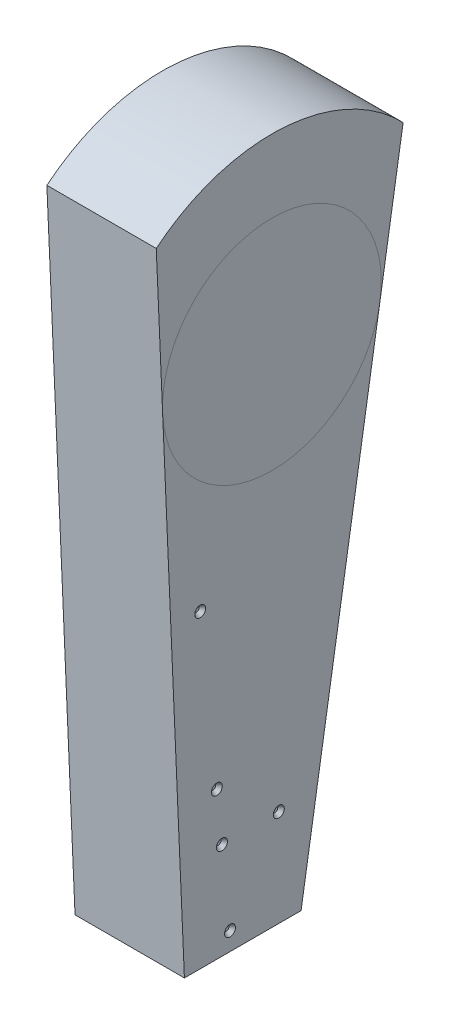
ISO-10303-21;
HEADER;
FILE_DESCRIPTION(('STEP AP214'),'2;1');
FILE_NAME('part.step','',(''),(''),'','','');
FILE_SCHEMA(('AUTOMOTIVE_DESIGN { 1 0 10303 214 1 1 1 1 }'));
ENDSEC;
DATA;
#1=APPLICATION_CONTEXT('core data for automotive mechanical design processes');
#2=APPLICATION_PROTOCOL_DEFINITION('international standard','automotive_design',2000,#1);
#3=PRODUCT_CONTEXT('',#1,'mechanical');
#4=PRODUCT('Part','Part','',(#3));
#5=PRODUCT_RELATED_PRODUCT_CATEGORY('part','',(#4));
#6=PRODUCT_DEFINITION_FORMATION('','',#4);
#7=PRODUCT_DEFINITION_CONTEXT('part definition',#1,'design');
#8=PRODUCT_DEFINITION('design','',#6,#7);
#9=PRODUCT_DEFINITION_SHAPE('','',#8);
#10=(LENGTH_UNIT() NAMED_UNIT(*) SI_UNIT(.MILLI.,.METRE.));
#11=(NAMED_UNIT(*) PLANE_ANGLE_UNIT() SI_UNIT($,.RADIAN.));
#12=(NAMED_UNIT(*) SI_UNIT($,.STERADIAN.) SOLID_ANGLE_UNIT());
#13=UNCERTAINTY_MEASURE_WITH_UNIT(LENGTH_MEASURE(1.E-05),#10,'distance_accuracy_value','');
#14=(GEOMETRIC_REPRESENTATION_CONTEXT(3) GLOBAL_UNCERTAINTY_ASSIGNED_CONTEXT((#13)) GLOBAL_UNIT_ASSIGNED_CONTEXT((#10,
#11,#12)) REPRESENTATION_CONTEXT('',''));
#15=CARTESIAN_POINT('',(0.,0.,0.));
#16=DIRECTION('',(0.,0.,1.));
#17=DIRECTION('',(1.,0.,0.));
#18=AXIS2_PLACEMENT_3D('',#15,#16,#17);
#19=CARTESIAN_POINT('',(76.2,-351.790000010146,60.94000004));
#20=DIRECTION('',(0.,1.,0.));
#21=DIRECTION('',(0.,0.,1.));
#22=AXIS2_PLACEMENT_3D('',#19,#20,#21);
#23=PLANE('',#22);
#24=DIRECTION('',(0.,0.,-1.));
#25=VECTOR('',#24,1.);
#26=CARTESIAN_POINT('',(0.,-351.790000010146,60.94000004));
#27=LINE('',#26,#25);
#28=CARTESIAN_POINT('',(0.,-351.790000010146,60.94000004));
#29=VERTEX_POINT('',#28);
#30=CARTESIAN_POINT('',(0.,-351.790000010146,-20.33999996));
#31=VERTEX_POINT('',#30);
#32=EDGE_CURVE('E108',#29,#31,#27,.T.);
#33=ORIENTED_EDGE('',*,*,#32,.T.);
#34=DIRECTION('',(-1.,0.,0.));
#35=VECTOR('',#34,1.);
#36=CARTESIAN_POINT('',(76.2,-351.790000010146,-20.33999996));
#37=LINE('',#36,#35);
#38=CARTESIAN_POINT('',(76.2,-351.790000010146,-20.33999996));
#39=VERTEX_POINT('',#38);
#40=EDGE_CURVE('E90',#39,#31,#37,.T.);
#41=ORIENTED_EDGE('',*,*,#40,.F.);
#42=DIRECTION('',(0.,0.,-1.));
#43=VECTOR('',#42,1.);
#44=CARTESIAN_POINT('',(76.2,-351.790000010146,60.94000004));
#45=LINE('',#44,#43);
#46=CARTESIAN_POINT('',(76.2,-351.790000010146,60.94000004));
#47=VERTEX_POINT('',#46);
#48=EDGE_CURVE('E97',#47,#39,#45,.T.);
#49=ORIENTED_EDGE('',*,*,#48,.F.);
#50=DIRECTION('',(-1.,0.,0.));
#51=VECTOR('',#50,1.);
#52=CARTESIAN_POINT('',(76.2,-351.790000010146,60.94000004));
#53=LINE('',#52,#51);
#54=EDGE_CURVE('E119',#47,#29,#53,.T.);
#55=ORIENTED_EDGE('',*,*,#54,.T.);
#56=EDGE_LOOP('',(#33,#41,#49,#55));
#57=FACE_BOUND('',#56,.T.);
#58=CARTESIAN_POINT('',(38.1,-351.790000010146,20.30000004));
#59=DIRECTION('',(0.,1.,0.));
#60=DIRECTION('',(0.,0.,1.));
#61=AXIS2_PLACEMENT_3D('',#58,#59,#60);
#62=CIRCLE('',#61,25.4);
#63=CARTESIAN_POINT('',(38.1,-351.790000010146,45.70000004));
#64=VERTEX_POINT('',#63);
#65=EDGE_CURVE('E11',#64,#64,#62,.F.);
#66=ORIENTED_EDGE('',*,*,#65,.F.);
#67=EDGE_LOOP('',(#66));
#68=FACE_BOUND('',#67,.T.);
#69=ADVANCED_FACE('F41',(#57,#68),#23,.F.);
#70=CARTESIAN_POINT('',(76.2,0.,0.));
#71=DIRECTION('',(1.,0.,0.));
#72=DIRECTION('',(0.,0.,-1.));
#73=AXIS2_PLACEMENT_3D('',#70,#71,#72);
#74=PLANE('',#73);
#75=CARTESIAN_POINT('',(76.2,-284.339077712489,-4.8194607374854));
#76=DIRECTION('',(1.,0.,0.));
#77=DIRECTION('',(0.,0.,-1.));
#78=AXIS2_PLACEMENT_3D('',#75,#76,#77);
#79=CIRCLE('',#78,3.81);
#80=CARTESIAN_POINT('',(76.2,-284.339077712489,-8.6294607374854));
#81=VERTEX_POINT('',#80);
#82=EDGE_CURVE('E158',#81,#81,#79,.T.);
#83=ORIENTED_EDGE('',*,*,#82,.F.);
#84=EDGE_LOOP('',(#83));
#85=FACE_BOUND('',#84,.T.);
#86=CARTESIAN_POINT('',(76.2,-339.090000010146,29.1719194246491));
#87=DIRECTION('',(1.,0.,0.));
#88=DIRECTION('',(0.,0.,-1.));
#89=AXIS2_PLACEMENT_3D('',#86,#87,#88);
#90=CIRCLE('',#89,3.81);
#91=CARTESIAN_POINT('',(76.2,-339.090000010146,25.3619194246491));
#92=VERTEX_POINT('',#91);
#93=EDGE_CURVE('E152',#92,#92,#90,.T.);
#94=ORIENTED_EDGE('',*,*,#93,.F.);
#95=EDGE_LOOP('',(#94));
#96=FACE_BOUND('',#95,.T.);
#97=CARTESIAN_POINT('',(76.2,-284.339077712489,34.768096530757));
#98=DIRECTION('',(1.,0.,0.));
#99=DIRECTION('',(0.,0.,-1.));
#100=AXIS2_PLACEMENT_3D('',#97,#98,#99);
#101=CIRCLE('',#100,3.81);
#102=CARTESIAN_POINT('',(76.2,-284.339077712489,30.958096530757));
#103=VERTEX_POINT('',#102);
#104=EDGE_CURVE('E146',#103,#103,#101,.T.);
#105=ORIENTED_EDGE('',*,*,#104,.F.);
#106=EDGE_LOOP('',(#105));
#107=FACE_BOUND('',#106,.T.);
#108=CARTESIAN_POINT('',(76.2,-249.174001321091,38.3623737991144));
#109=DIRECTION('',(1.,0.,0.));
#110=DIRECTION('',(0.,0.,-1.));
#111=AXIS2_PLACEMENT_3D('',#108,#109,#110);
#112=CIRCLE('',#111,3.81);
#113=CARTESIAN_POINT('',(76.2,-249.174001321091,34.5523737991144));
#114=VERTEX_POINT('',#113);
#115=EDGE_CURVE('E140',#114,#114,#112,.T.);
#116=ORIENTED_EDGE('',*,*,#115,.F.);
#117=EDGE_LOOP('',(#116));
#118=FACE_BOUND('',#117,.T.);
#119=CARTESIAN_POINT('',(76.2,-136.12684472737,49.9170998766228));
#120=DIRECTION('',(1.,0.,0.));
#121=DIRECTION('',(0.,0.,-1.));
#122=AXIS2_PLACEMENT_3D('',#119,#120,#121);
#123=CIRCLE('',#122,3.81);
#124=CARTESIAN_POINT('',(76.2,-136.12684472737,46.1070998766228));
#125=VERTEX_POINT('',#124);
#126=EDGE_CURVE('E134',#125,#125,#123,.T.);
#127=ORIENTED_EDGE('',*,*,#126,.F.);
#128=EDGE_LOOP('',(#127));
#129=FACE_BOUND('',#128,.T.);
#130=DIRECTION('',(0.,0.987193343380157,-0.159528376115059));
#131=VECTOR('',#130,1.);
#132=CARTESIAN_POINT('',(76.2,-351.790000010146,-20.33999996));
#133=LINE('',#132,#131);
#134=CARTESIAN_POINT('',(76.2,-12.1560622599675,-75.2241327655679));
#135=VERTEX_POINT('',#134);
#136=EDGE_CURVE('E86',#39,#135,#133,.T.);
#137=ORIENTED_EDGE('',*,*,#136,.T.);
#138=CARTESIAN_POINT('',(76.2,0.,0.));
#139=DIRECTION('',(1.,0.,0.));
#140=DIRECTION('',(0.,0.,-1.));
#141=AXIS2_PLACEMENT_3D('',#138,#139,#140);
#142=CIRCLE('',#141,76.2);
#143=CARTESIAN_POINT('',(76.2,-3.31793432435695,76.1277302421349));
#144=VERTEX_POINT('',#143);
#145=EDGE_CURVE('E50',#135,#144,#142,.F.);
#146=ORIENTED_EDGE('',*,*,#145,.T.);
#147=DIRECTION('',(0.,-0.999051577980772,-0.0435424452015347));
#148=VECTOR('',#147,1.);
#149=CARTESIAN_POINT('',(76.2,-351.790000010146,60.94000004));
#150=LINE('',#149,#148);
#151=EDGE_CURVE('E100',#144,#47,#150,.T.);
#152=ORIENTED_EDGE('',*,*,#151,.T.);
#153=ORIENTED_EDGE('',*,*,#48,.T.);
#154=EDGE_LOOP('',(#137,#146,#152,#153));
#155=FACE_BOUND('',#154,.T.);
#156=ADVANCED_FACE('F98',(#85,#96,#107,#118,#129,#155),#74,.T.);
#157=CARTESIAN_POINT('',(76.2,98.1857059984895,80.5516426746108));
#158=VERTEX_POINT('',#157);
#159=EDGE_CURVE('E121',#158,#144,#150,.T.);
#160=ORIENTED_EDGE('',*,*,#159,.T.);
#161=EDGE_CURVE('E109',#144,#135,#142,.F.);
#162=ORIENTED_EDGE('',*,*,#161,.T.);
#163=CARTESIAN_POINT('',(76.2,88.1427814274564,-91.432215778858));
#164=VERTEX_POINT('',#163);
#165=EDGE_CURVE('E93',#135,#164,#133,.T.);
#166=ORIENTED_EDGE('',*,*,#165,.T.);
#167=CARTESIAN_POINT('',(76.2,0.,0.));
#168=DIRECTION('',(1.,0.,0.));
#169=DIRECTION('',(0.,0.,-1.));
#170=AXIS2_PLACEMENT_3D('',#167,#168,#169);
#171=CIRCLE('',#170,127.);
#172=EDGE_CURVE('E94',#164,#158,#171,.T.);
#173=ORIENTED_EDGE('',*,*,#172,.T.);
#174=EDGE_LOOP('',(#160,#162,#166,#173));
#175=FACE_BOUND('',#174,.T.);
#176=ADVANCED_FACE('F240',(#175),#74,.T.);
#177=ORIENTED_EDGE('',*,*,#65,.T.);
#178=EDGE_LOOP('',(#177));
#179=FACE_BOUND('',#178,.T.);
#180=ADVANCED_FACE('F43',(#179),#23,.F.);
#181=CARTESIAN_POINT('',(76.2,-351.790000010146,-20.33999996));
#182=DIRECTION('',(0.,0.15952837611506,0.987193343380157));
#183=DIRECTION('',(0.,-0.987193343380157,0.15952837611506));
#184=AXIS2_PLACEMENT_3D('',#181,#182,#183);
#185=PLANE('',#184);
#186=DIRECTION('',(0.,0.987193343380157,-0.159528376115059));
#187=VECTOR('',#186,1.);
#188=CARTESIAN_POINT('',(0.,-351.790000010146,-20.33999996));
#189=LINE('',#188,#187);
#190=CARTESIAN_POINT('',(0.,88.1427814274564,-91.432215778858));
#191=VERTEX_POINT('',#190);
#192=EDGE_CURVE('E125',#31,#191,#189,.T.);
#193=ORIENTED_EDGE('',*,*,#192,.T.);
#194=DIRECTION('',(-1.,0.,0.));
#195=VECTOR('',#194,1.);
#196=CARTESIAN_POINT('',(76.2,88.1427814274564,-91.432215778858));
#197=LINE('',#196,#195);
#198=EDGE_CURVE('E110',#164,#191,#197,.T.);
#199=ORIENTED_EDGE('',*,*,#198,.F.);
#200=ORIENTED_EDGE('',*,*,#165,.F.);
#201=ORIENTED_EDGE('',*,*,#136,.F.);
#202=ORIENTED_EDGE('',*,*,#40,.T.);
#203=EDGE_LOOP('',(#193,#199,#200,#201,#202));
#204=FACE_BOUND('',#203,.T.);
#205=ADVANCED_FACE('F88',(#204),#185,.F.);
#206=CARTESIAN_POINT('',(76.2,0.,0.));
#207=DIRECTION('',(-1.,0.,0.));
#208=DIRECTION('',(0.,0.,1.));
#209=AXIS2_PLACEMENT_3D('',#206,#207,#208);
#210=CYLINDRICAL_SURFACE('',#209,127.);
#211=CARTESIAN_POINT('',(0.,0.,0.));
#212=DIRECTION('',(1.,0.,0.));
#213=DIRECTION('',(0.,0.,-1.));
#214=AXIS2_PLACEMENT_3D('',#211,#212,#213);
#215=CIRCLE('',#214,127.);
#216=CARTESIAN_POINT('',(0.,98.1857059984895,80.5516426746108));
#217=VERTEX_POINT('',#216);
#218=EDGE_CURVE('E123',#191,#217,#215,.T.);
#219=ORIENTED_EDGE('',*,*,#218,.T.);
#220=DIRECTION('',(-1.,0.,0.));
#221=VECTOR('',#220,1.);
#222=CARTESIAN_POINT('',(76.2,98.1857059984895,80.5516426746108));
#223=LINE('',#222,#221);
#224=EDGE_CURVE('E114',#158,#217,#223,.T.);
#225=ORIENTED_EDGE('',*,*,#224,.F.);
#226=ORIENTED_EDGE('',*,*,#172,.F.);
#227=ORIENTED_EDGE('',*,*,#198,.T.);
#228=EDGE_LOOP('',(#219,#225,#226,#227));
#229=FACE_BOUND('',#228,.T.);
#230=ADVANCED_FACE('F236',(#229),#210,.T.);
#231=CARTESIAN_POINT('',(76.2,-351.790000010146,60.94000004));
#232=DIRECTION('',(0.,0.0435424452015347,-0.999051577980772));
#233=DIRECTION('',(0.,0.999051577980772,0.0435424452015347));
#234=AXIS2_PLACEMENT_3D('',#231,#232,#233);
#235=PLANE('',#234);
#236=DIRECTION('',(0.,-0.999051577980772,-0.0435424452015347));
#237=VECTOR('',#236,1.);
#238=CARTESIAN_POINT('',(0.,-351.790000010146,60.94000004));
#239=LINE('',#238,#237);
#240=EDGE_CURVE('E104',#217,#29,#239,.T.);
#241=ORIENTED_EDGE('',*,*,#240,.T.);
#242=ORIENTED_EDGE('',*,*,#54,.F.);
#243=ORIENTED_EDGE('',*,*,#151,.F.);
#244=ORIENTED_EDGE('',*,*,#159,.F.);
#245=ORIENTED_EDGE('',*,*,#224,.T.);
#246=EDGE_LOOP('',(#241,#242,#243,#244,#245));
#247=FACE_BOUND('',#246,.T.);
#248=ADVANCED_FACE('F242',(#247),#235,.F.);
#249=ORIENTED_EDGE('',*,*,#145,.F.);
#250=ORIENTED_EDGE('',*,*,#161,.F.);
#251=EDGE_LOOP('',(#249,#250));
#252=FACE_BOUND('',#251,.T.);
#253=ADVANCED_FACE('F216',(#252),#74,.T.);
#254=CARTESIAN_POINT('',(0.,0.,0.));
#255=DIRECTION('',(1.,0.,0.));
#256=DIRECTION('',(0.,0.,-1.));
#257=AXIS2_PLACEMENT_3D('',#254,#255,#256);
#258=PLANE('',#257);
#259=CARTESIAN_POINT('',(0.,-152.285748197801,48.2654731666759));
#260=DIRECTION('',(-1.,0.,0.));
#261=DIRECTION('',(0.,0.,1.));
#262=AXIS2_PLACEMENT_3D('',#259,#260,#261);
#263=CIRCLE('',#262,3.81);
#264=CARTESIAN_POINT('',(0.,-152.285748197801,52.0754731666759));
#265=VERTEX_POINT('',#264);
#266=EDGE_CURVE('E206',#265,#265,#263,.T.);
#267=ORIENTED_EDGE('',*,*,#266,.F.);
#268=EDGE_LOOP('',(#267));
#269=FACE_BOUND('',#268,.T.);
#270=CARTESIAN_POINT('',(0.,57.9298746193023,69.7519396294631));
#271=DIRECTION('',(-1.,0.,0.));
#272=DIRECTION('',(0.,0.,1.));
#273=AXIS2_PLACEMENT_3D('',#270,#271,#272);
#274=CIRCLE('',#273,3.81);
#275=CARTESIAN_POINT('',(0.,57.9298746193023,73.5619396294631));
#276=VERTEX_POINT('',#275);
#277=EDGE_CURVE('E200',#276,#276,#274,.T.);
#278=ORIENTED_EDGE('',*,*,#277,.F.);
#279=EDGE_LOOP('',(#278));
#280=FACE_BOUND('',#279,.T.);
#281=CARTESIAN_POINT('',(0.,103.609527071582,48.2654731666759));
#282=DIRECTION('',(-1.,0.,0.));
#283=DIRECTION('',(0.,0.,1.));
#284=AXIS2_PLACEMENT_3D('',#281,#282,#283);
#285=CIRCLE('',#284,3.81);
#286=CARTESIAN_POINT('',(0.,103.609527071582,52.0754731666759));
#287=VERTEX_POINT('',#286);
#288=EDGE_CURVE('E194',#287,#287,#285,.T.);
#289=ORIENTED_EDGE('',*,*,#288,.F.);
#290=EDGE_LOOP('',(#289));
#291=FACE_BOUND('',#290,.T.);
#292=CARTESIAN_POINT('',(0.,103.609527071582,-48.265473166676));
#293=DIRECTION('',(-1.,0.,0.));
#294=DIRECTION('',(0.,0.,1.));
#295=AXIS2_PLACEMENT_3D('',#292,#293,#294);
#296=CIRCLE('',#295,3.81);
#297=CARTESIAN_POINT('',(0.,103.609527071582,-44.455473166676));
#298=VERTEX_POINT('',#297);
#299=EDGE_CURVE('E188',#298,#298,#296,.T.);
#300=ORIENTED_EDGE('',*,*,#299,.F.);
#301=EDGE_LOOP('',(#300));
#302=FACE_BOUND('',#301,.T.);
#303=CARTESIAN_POINT('',(0.,57.9298746193023,-69.7519396294631));
#304=DIRECTION('',(-1.,0.,0.));
#305=DIRECTION('',(0.,0.,1.));
#306=AXIS2_PLACEMENT_3D('',#303,#304,#305);
#307=CIRCLE('',#306,3.81);
#308=CARTESIAN_POINT('',(0.,57.9298746193023,-65.9419396294631));
#309=VERTEX_POINT('',#308);
#310=EDGE_CURVE('E182',#309,#309,#307,.T.);
#311=ORIENTED_EDGE('',*,*,#310,.F.);
#312=EDGE_LOOP('',(#311));
#313=FACE_BOUND('',#312,.T.);
#314=CARTESIAN_POINT('',(0.,-152.285748197801,-48.265473166676));
#315=DIRECTION('',(-1.,0.,0.));
#316=DIRECTION('',(0.,0.,1.));
#317=AXIS2_PLACEMENT_3D('',#314,#315,#316);
#318=CIRCLE('',#317,3.81);
#319=CARTESIAN_POINT('',(0.,-152.285748197801,-44.4554731666759));
#320=VERTEX_POINT('',#319);
#321=EDGE_CURVE('E176',#320,#320,#318,.T.);
#322=ORIENTED_EDGE('',*,*,#321,.F.);
#323=EDGE_LOOP('',(#322));
#324=FACE_BOUND('',#323,.T.);
#325=CARTESIAN_POINT('',(0.,-339.090000010146,12.5568506506859));
#326=DIRECTION('',(-1.,0.,0.));
#327=DIRECTION('',(0.,0.,-1.));
#328=AXIS2_PLACEMENT_3D('',#325,#326,#327);
#329=CIRCLE('',#328,3.81);
#330=CARTESIAN_POINT('',(0.,-339.090000010146,8.74685065068594));
#331=VERTEX_POINT('',#330);
#332=EDGE_CURVE('E170',#331,#331,#329,.T.);
#333=ORIENTED_EDGE('',*,*,#332,.F.);
#334=EDGE_LOOP('',(#333));
#335=FACE_BOUND('',#334,.T.);
#336=CARTESIAN_POINT('',(0.,-339.090000010146,-12.556850650686));
#337=DIRECTION('',(-1.,0.,0.));
#338=DIRECTION('',(0.,0.,1.));
#339=AXIS2_PLACEMENT_3D('',#336,#337,#338);
#340=CIRCLE('',#339,3.81);
#341=CARTESIAN_POINT('',(0.,-339.090000010146,-8.746850650686));
#342=VERTEX_POINT('',#341);
#343=EDGE_CURVE('E164',#342,#342,#340,.T.);
#344=ORIENTED_EDGE('',*,*,#343,.F.);
#345=EDGE_LOOP('',(#344));
#346=FACE_BOUND('',#345,.T.);
#347=ORIENTED_EDGE('',*,*,#32,.F.);
#348=ORIENTED_EDGE('',*,*,#240,.F.);
#349=ORIENTED_EDGE('',*,*,#218,.F.);
#350=ORIENTED_EDGE('',*,*,#192,.F.);
#351=EDGE_LOOP('',(#347,#348,#349,#350));
#352=FACE_BOUND('',#351,.T.);
#353=ADVANCED_FACE('F212',(#269,#280,#291,#302,#313,#324,#335,#346,#352),#258,.F.);
#354=CARTESIAN_POINT('',(76.2,-136.12684472737,49.9170998766228));
#355=DIRECTION('',(1.,0.,0.));
#356=DIRECTION('',(0.,0.,-1.));
#357=AXIS2_PLACEMENT_3D('',#354,#355,#356);
#358=CONICAL_SURFACE('',#357,3.81,0.680678408277789);
#359=CARTESIAN_POINT('',(73.66,-136.12684472737,49.9170998766228));
#360=DIRECTION('',(1.,0.,0.));
#361=DIRECTION('',(0.,0.,-1.));
#362=AXIS2_PLACEMENT_3D('',#359,#360,#361);
#363=CIRCLE('',#362,1.75314855568468);
#364=CARTESIAN_POINT('',(73.66,-136.12684472737,48.1639513209381));
#365=VERTEX_POINT('',#364);
#366=EDGE_CURVE('E128',#365,#365,#363,.T.);
#367=ORIENTED_EDGE('',*,*,#366,.F.);
#368=EDGE_LOOP('',(#367));
#369=FACE_BOUND('',#368,.T.);
#370=ORIENTED_EDGE('',*,*,#126,.T.);
#371=EDGE_LOOP('',(#370));
#372=FACE_BOUND('',#371,.T.);
#373=ADVANCED_FACE('F215',(#369,#372),#358,.F.);
#374=CARTESIAN_POINT('',(73.66,-136.12684472737,49.9170998766228));
#375=DIRECTION('',(1.,0.,0.));
#376=DIRECTION('',(0.,0.,-1.));
#377=AXIS2_PLACEMENT_3D('',#374,#375,#376);
#378=PLANE('',#377);
#379=ORIENTED_EDGE('',*,*,#366,.T.);
#380=EDGE_LOOP('',(#379));
#381=FACE_BOUND('',#380,.T.);
#382=ADVANCED_FACE('F268',(#381),#378,.T.);
#383=CARTESIAN_POINT('',(76.2,-249.174001321091,38.3623737991144));
#384=DIRECTION('',(1.,0.,0.));
#385=DIRECTION('',(0.,0.,-1.));
#386=AXIS2_PLACEMENT_3D('',#383,#384,#385);
#387=CONICAL_SURFACE('',#386,3.81,0.680678408277789);
#388=CARTESIAN_POINT('',(73.66,-249.174001321091,38.3623737991144));
#389=DIRECTION('',(1.,0.,0.));
#390=DIRECTION('',(0.,0.,-1.));
#391=AXIS2_PLACEMENT_3D('',#388,#389,#390);
#392=CIRCLE('',#391,1.75314855568468);
#393=CARTESIAN_POINT('',(73.66,-249.174001321091,36.6092252434297));
#394=VERTEX_POINT('',#393);
#395=EDGE_CURVE('E137',#394,#394,#392,.T.);
#396=ORIENTED_EDGE('',*,*,#395,.F.);
#397=EDGE_LOOP('',(#396));
#398=FACE_BOUND('',#397,.T.);
#399=ORIENTED_EDGE('',*,*,#115,.T.);
#400=EDGE_LOOP('',(#399));
#401=FACE_BOUND('',#400,.T.);
#402=ADVANCED_FACE('F272',(#398,#401),#387,.F.);
#403=CARTESIAN_POINT('',(73.66,-249.174001321091,38.3623737991144));
#404=DIRECTION('',(1.,0.,0.));
#405=DIRECTION('',(0.,0.,-1.));
#406=AXIS2_PLACEMENT_3D('',#403,#404,#405);
#407=PLANE('',#406);
#408=ORIENTED_EDGE('',*,*,#395,.T.);
#409=EDGE_LOOP('',(#408));
#410=FACE_BOUND('',#409,.T.);
#411=ADVANCED_FACE('F276',(#410),#407,.T.);
#412=CARTESIAN_POINT('',(76.2,-284.339077712489,34.768096530757));
#413=DIRECTION('',(1.,0.,0.));
#414=DIRECTION('',(0.,0.,-1.));
#415=AXIS2_PLACEMENT_3D('',#412,#413,#414);
#416=CONICAL_SURFACE('',#415,3.81,0.680678408277789);
#417=CARTESIAN_POINT('',(73.66,-284.339077712489,34.768096530757));
#418=DIRECTION('',(1.,0.,0.));
#419=DIRECTION('',(0.,0.,-1.));
#420=AXIS2_PLACEMENT_3D('',#417,#418,#419);
#421=CIRCLE('',#420,1.75314855568468);
#422=CARTESIAN_POINT('',(73.66,-284.339077712489,33.0149479750723));
#423=VERTEX_POINT('',#422);
#424=EDGE_CURVE('E143',#423,#423,#421,.T.);
#425=ORIENTED_EDGE('',*,*,#424,.F.);
#426=EDGE_LOOP('',(#425));
#427=FACE_BOUND('',#426,.T.);
#428=ORIENTED_EDGE('',*,*,#104,.T.);
#429=EDGE_LOOP('',(#428));
#430=FACE_BOUND('',#429,.T.);
#431=ADVANCED_FACE('F280',(#427,#430),#416,.F.);
#432=CARTESIAN_POINT('',(73.66,-284.339077712489,34.768096530757));
#433=DIRECTION('',(1.,0.,0.));
#434=DIRECTION('',(0.,0.,-1.));
#435=AXIS2_PLACEMENT_3D('',#432,#433,#434);
#436=PLANE('',#435);
#437=ORIENTED_EDGE('',*,*,#424,.T.);
#438=EDGE_LOOP('',(#437));
#439=FACE_BOUND('',#438,.T.);
#440=ADVANCED_FACE('F284',(#439),#436,.T.);
#441=CARTESIAN_POINT('',(76.2,-339.090000010146,29.1719194246491));
#442=DIRECTION('',(1.,0.,0.));
#443=DIRECTION('',(0.,0.,-1.));
#444=AXIS2_PLACEMENT_3D('',#441,#442,#443);
#445=CONICAL_SURFACE('',#444,3.81,0.680678408277789);
#446=CARTESIAN_POINT('',(73.66,-339.090000010146,29.1719194246491));
#447=DIRECTION('',(1.,0.,0.));
#448=DIRECTION('',(0.,0.,-1.));
#449=AXIS2_PLACEMENT_3D('',#446,#447,#448);
#450=CIRCLE('',#449,1.75314855568468);
#451=CARTESIAN_POINT('',(73.66,-339.090000010146,27.4187708689645));
#452=VERTEX_POINT('',#451);
#453=EDGE_CURVE('E149',#452,#452,#450,.T.);
#454=ORIENTED_EDGE('',*,*,#453,.F.);
#455=EDGE_LOOP('',(#454));
#456=FACE_BOUND('',#455,.T.);
#457=ORIENTED_EDGE('',*,*,#93,.T.);
#458=EDGE_LOOP('',(#457));
#459=FACE_BOUND('',#458,.T.);
#460=ADVANCED_FACE('F288',(#456,#459),#445,.F.);
#461=CARTESIAN_POINT('',(73.66,-339.090000010146,29.1719194246491));
#462=DIRECTION('',(1.,0.,0.));
#463=DIRECTION('',(0.,0.,-1.));
#464=AXIS2_PLACEMENT_3D('',#461,#462,#463);
#465=PLANE('',#464);
#466=ORIENTED_EDGE('',*,*,#453,.T.);
#467=EDGE_LOOP('',(#466));
#468=FACE_BOUND('',#467,.T.);
#469=ADVANCED_FACE('F292',(#468),#465,.T.);
#470=CARTESIAN_POINT('',(76.2,-284.339077712489,-4.8194607374854));
#471=DIRECTION('',(1.,0.,0.));
#472=DIRECTION('',(0.,0.,-1.));
#473=AXIS2_PLACEMENT_3D('',#470,#471,#472);
#474=CONICAL_SURFACE('',#473,3.81,0.680678408277789);
#475=CARTESIAN_POINT('',(73.66,-284.339077712489,-4.8194607374854));
#476=DIRECTION('',(1.,0.,0.));
#477=DIRECTION('',(0.,0.,-1.));
#478=AXIS2_PLACEMENT_3D('',#475,#476,#477);
#479=CIRCLE('',#478,1.75314855568468);
#480=CARTESIAN_POINT('',(73.66,-284.339077712489,-6.57260929317008));
#481=VERTEX_POINT('',#480);
#482=EDGE_CURVE('E155',#481,#481,#479,.T.);
#483=ORIENTED_EDGE('',*,*,#482,.F.);
#484=EDGE_LOOP('',(#483));
#485=FACE_BOUND('',#484,.T.);
#486=ORIENTED_EDGE('',*,*,#82,.T.);
#487=EDGE_LOOP('',(#486));
#488=FACE_BOUND('',#487,.T.);
#489=ADVANCED_FACE('F296',(#485,#488),#474,.F.);
#490=CARTESIAN_POINT('',(73.66,-284.339077712489,-4.8194607374854));
#491=DIRECTION('',(1.,0.,0.));
#492=DIRECTION('',(0.,0.,-1.));
#493=AXIS2_PLACEMENT_3D('',#490,#491,#492);
#494=PLANE('',#493);
#495=ORIENTED_EDGE('',*,*,#482,.T.);
#496=EDGE_LOOP('',(#495));
#497=FACE_BOUND('',#496,.T.);
#498=ADVANCED_FACE('F300',(#497),#494,.T.);
#499=CARTESIAN_POINT('',(0.,-339.090000010146,-12.556850650686));
#500=DIRECTION('',(-1.,0.,0.));
#501=DIRECTION('',(0.,0.,1.));
#502=AXIS2_PLACEMENT_3D('',#499,#500,#501);
#503=CONICAL_SURFACE('',#502,3.81,0.680678408277789);
#504=CARTESIAN_POINT('',(2.54,-339.090000010146,-12.556850650686));
#505=DIRECTION('',(-1.,0.,0.));
#506=DIRECTION('',(0.,0.,1.));
#507=AXIS2_PLACEMENT_3D('',#504,#505,#506);
#508=CIRCLE('',#507,1.75314855568468);
#509=CARTESIAN_POINT('',(2.54,-339.090000010146,-10.8037020950013));
#510=VERTEX_POINT('',#509);
#511=EDGE_CURVE('E161',#510,#510,#508,.T.);
#512=ORIENTED_EDGE('',*,*,#511,.F.);
#513=EDGE_LOOP('',(#512));
#514=FACE_BOUND('',#513,.T.);
#515=ORIENTED_EDGE('',*,*,#343,.T.);
#516=EDGE_LOOP('',(#515));
#517=FACE_BOUND('',#516,.T.);
#518=ADVANCED_FACE('F304',(#514,#517),#503,.F.);
#519=CARTESIAN_POINT('',(2.54,-339.090000010146,-12.556850650686));
#520=DIRECTION('',(-1.,0.,0.));
#521=DIRECTION('',(0.,0.,1.));
#522=AXIS2_PLACEMENT_3D('',#519,#520,#521);
#523=PLANE('',#522);
#524=ORIENTED_EDGE('',*,*,#511,.T.);
#525=EDGE_LOOP('',(#524));
#526=FACE_BOUND('',#525,.T.);
#527=ADVANCED_FACE('F308',(#526),#523,.T.);
#528=CARTESIAN_POINT('',(0.,-339.090000010146,12.5568506506859));
#529=DIRECTION('',(-1.,0.,0.));
#530=DIRECTION('',(0.,0.,-1.));
#531=AXIS2_PLACEMENT_3D('',#528,#529,#530);
#532=CONICAL_SURFACE('',#531,3.81,0.680678408277789);
#533=CARTESIAN_POINT('',(2.54,-339.090000010146,12.5568506506859));
#534=DIRECTION('',(1.,0.,0.));
#535=DIRECTION('',(0.,0.,-1.));
#536=AXIS2_PLACEMENT_3D('',#533,#534,#535);
#537=CIRCLE('',#536,1.75314855568468);
#538=CARTESIAN_POINT('',(2.54,-339.090000010146,10.8037020950013));
#539=VERTEX_POINT('',#538);
#540=EDGE_CURVE('E167',#539,#539,#537,.F.);
#541=ORIENTED_EDGE('',*,*,#540,.F.);
#542=EDGE_LOOP('',(#541));
#543=FACE_BOUND('',#542,.T.);
#544=ORIENTED_EDGE('',*,*,#332,.T.);
#545=EDGE_LOOP('',(#544));
#546=FACE_BOUND('',#545,.T.);
#547=ADVANCED_FACE('F312',(#543,#546),#532,.F.);
#548=CARTESIAN_POINT('',(2.54,-339.090000010146,12.5568506506859));
#549=DIRECTION('',(1.,0.,0.));
#550=DIRECTION('',(0.,0.,-1.));
#551=AXIS2_PLACEMENT_3D('',#548,#549,#550);
#552=PLANE('',#551);
#553=ORIENTED_EDGE('',*,*,#540,.T.);
#554=EDGE_LOOP('',(#553));
#555=FACE_BOUND('',#554,.T.);
#556=ADVANCED_FACE('F316',(#555),#552,.F.);
#557=CARTESIAN_POINT('',(0.,-152.285748197801,-48.265473166676));
#558=DIRECTION('',(-1.,0.,0.));
#559=DIRECTION('',(0.,0.,1.));
#560=AXIS2_PLACEMENT_3D('',#557,#558,#559);
#561=CONICAL_SURFACE('',#560,3.81,0.680678408277789);
#562=CARTESIAN_POINT('',(2.54,-152.285748197801,-48.265473166676));
#563=DIRECTION('',(-1.,0.,0.));
#564=DIRECTION('',(0.,0.,1.));
#565=AXIS2_PLACEMENT_3D('',#562,#563,#564);
#566=CIRCLE('',#565,1.75314855568468);
#567=CARTESIAN_POINT('',(2.54,-152.285748197801,-46.5123246109913));
#568=VERTEX_POINT('',#567);
#569=EDGE_CURVE('E173',#568,#568,#566,.T.);
#570=ORIENTED_EDGE('',*,*,#569,.F.);
#571=EDGE_LOOP('',(#570));
#572=FACE_BOUND('',#571,.T.);
#573=ORIENTED_EDGE('',*,*,#321,.T.);
#574=EDGE_LOOP('',(#573));
#575=FACE_BOUND('',#574,.T.);
#576=ADVANCED_FACE('F320',(#572,#575),#561,.F.);
#577=CARTESIAN_POINT('',(2.54,-152.285748197801,-48.265473166676));
#578=DIRECTION('',(-1.,0.,0.));
#579=DIRECTION('',(0.,0.,1.));
#580=AXIS2_PLACEMENT_3D('',#577,#578,#579);
#581=PLANE('',#580);
#582=ORIENTED_EDGE('',*,*,#569,.T.);
#583=EDGE_LOOP('',(#582));
#584=FACE_BOUND('',#583,.T.);
#585=ADVANCED_FACE('F324',(#584),#581,.T.);
#586=CARTESIAN_POINT('',(0.,57.9298746193023,-69.7519396294631));
#587=DIRECTION('',(-1.,0.,0.));
#588=DIRECTION('',(0.,0.,1.));
#589=AXIS2_PLACEMENT_3D('',#586,#587,#588);
#590=CONICAL_SURFACE('',#589,3.81,0.680678408277789);
#591=CARTESIAN_POINT('',(2.54,57.9298746193023,-69.7519396294631));
#592=DIRECTION('',(-1.,0.,0.));
#593=DIRECTION('',(0.,0.,1.));
#594=AXIS2_PLACEMENT_3D('',#591,#592,#593);
#595=CIRCLE('',#594,1.75314855568468);
#596=CARTESIAN_POINT('',(2.54,57.9298746193023,-67.9987910737784));
#597=VERTEX_POINT('',#596);
#598=EDGE_CURVE('E179',#597,#597,#595,.T.);
#599=ORIENTED_EDGE('',*,*,#598,.F.);
#600=EDGE_LOOP('',(#599));
#601=FACE_BOUND('',#600,.T.);
#602=ORIENTED_EDGE('',*,*,#310,.T.);
#603=EDGE_LOOP('',(#602));
#604=FACE_BOUND('',#603,.T.);
#605=ADVANCED_FACE('F328',(#601,#604),#590,.F.);
#606=CARTESIAN_POINT('',(2.54,57.9298746193023,-69.7519396294631));
#607=DIRECTION('',(-1.,0.,0.));
#608=DIRECTION('',(0.,0.,1.));
#609=AXIS2_PLACEMENT_3D('',#606,#607,#608);
#610=PLANE('',#609);
#611=ORIENTED_EDGE('',*,*,#598,.T.);
#612=EDGE_LOOP('',(#611));
#613=FACE_BOUND('',#612,.T.);
#614=ADVANCED_FACE('F332',(#613),#610,.T.);
#615=CARTESIAN_POINT('',(0.,103.609527071582,-48.265473166676));
#616=DIRECTION('',(-1.,0.,0.));
#617=DIRECTION('',(0.,0.,1.));
#618=AXIS2_PLACEMENT_3D('',#615,#616,#617);
#619=CONICAL_SURFACE('',#618,3.81,0.680678408277789);
#620=CARTESIAN_POINT('',(2.54,103.609527071582,-48.265473166676));
#621=DIRECTION('',(-1.,0.,0.));
#622=DIRECTION('',(0.,0.,1.));
#623=AXIS2_PLACEMENT_3D('',#620,#621,#622);
#624=CIRCLE('',#623,1.75314855568468);
#625=CARTESIAN_POINT('',(2.54,103.609527071582,-46.5123246109913));
#626=VERTEX_POINT('',#625);
#627=EDGE_CURVE('E185',#626,#626,#624,.T.);
#628=ORIENTED_EDGE('',*,*,#627,.F.);
#629=EDGE_LOOP('',(#628));
#630=FACE_BOUND('',#629,.T.);
#631=ORIENTED_EDGE('',*,*,#299,.T.);
#632=EDGE_LOOP('',(#631));
#633=FACE_BOUND('',#632,.T.);
#634=ADVANCED_FACE('F336',(#630,#633),#619,.F.);
#635=CARTESIAN_POINT('',(2.54,103.609527071582,-48.265473166676));
#636=DIRECTION('',(-1.,0.,0.));
#637=DIRECTION('',(0.,0.,1.));
#638=AXIS2_PLACEMENT_3D('',#635,#636,#637);
#639=PLANE('',#638);
#640=ORIENTED_EDGE('',*,*,#627,.T.);
#641=EDGE_LOOP('',(#640));
#642=FACE_BOUND('',#641,.T.);
#643=ADVANCED_FACE('F340',(#642),#639,.T.);
#644=CARTESIAN_POINT('',(0.,103.609527071582,48.2654731666759));
#645=DIRECTION('',(-1.,0.,0.));
#646=DIRECTION('',(0.,0.,1.));
#647=AXIS2_PLACEMENT_3D('',#644,#645,#646);
#648=CONICAL_SURFACE('',#647,3.81,0.680678408277789);
#649=CARTESIAN_POINT('',(2.54,103.609527071582,48.2654731666759));
#650=DIRECTION('',(-1.,0.,0.));
#651=DIRECTION('',(0.,0.,1.));
#652=AXIS2_PLACEMENT_3D('',#649,#650,#651);
#653=CIRCLE('',#652,1.75314855568468);
#654=CARTESIAN_POINT('',(2.54,103.609527071582,50.0186217223606));
#655=VERTEX_POINT('',#654);
#656=EDGE_CURVE('E191',#655,#655,#653,.T.);
#657=ORIENTED_EDGE('',*,*,#656,.F.);
#658=EDGE_LOOP('',(#657));
#659=FACE_BOUND('',#658,.T.);
#660=ORIENTED_EDGE('',*,*,#288,.T.);
#661=EDGE_LOOP('',(#660));
#662=FACE_BOUND('',#661,.T.);
#663=ADVANCED_FACE('F344',(#659,#662),#648,.F.);
#664=CARTESIAN_POINT('',(2.54,103.609527071582,48.2654731666759));
#665=DIRECTION('',(-1.,0.,0.));
#666=DIRECTION('',(0.,0.,1.));
#667=AXIS2_PLACEMENT_3D('',#664,#665,#666);
#668=PLANE('',#667);
#669=ORIENTED_EDGE('',*,*,#656,.T.);
#670=EDGE_LOOP('',(#669));
#671=FACE_BOUND('',#670,.T.);
#672=ADVANCED_FACE('F348',(#671),#668,.T.);
#673=CARTESIAN_POINT('',(0.,57.9298746193023,69.7519396294631));
#674=DIRECTION('',(-1.,0.,0.));
#675=DIRECTION('',(0.,0.,1.));
#676=AXIS2_PLACEMENT_3D('',#673,#674,#675);
#677=CONICAL_SURFACE('',#676,3.81,0.680678408277789);
#678=CARTESIAN_POINT('',(2.54,57.9298746193023,69.7519396294631));
#679=DIRECTION('',(-1.,0.,0.));
#680=DIRECTION('',(0.,0.,1.));
#681=AXIS2_PLACEMENT_3D('',#678,#679,#680);
#682=CIRCLE('',#681,1.75314855568468);
#683=CARTESIAN_POINT('',(2.54,57.9298746193023,71.5050881851478));
#684=VERTEX_POINT('',#683);
#685=EDGE_CURVE('E197',#684,#684,#682,.T.);
#686=ORIENTED_EDGE('',*,*,#685,.F.);
#687=EDGE_LOOP('',(#686));
#688=FACE_BOUND('',#687,.T.);
#689=ORIENTED_EDGE('',*,*,#277,.T.);
#690=EDGE_LOOP('',(#689));
#691=FACE_BOUND('',#690,.T.);
#692=ADVANCED_FACE('F352',(#688,#691),#677,.F.);
#693=CARTESIAN_POINT('',(2.54,57.9298746193023,69.7519396294631));
#694=DIRECTION('',(-1.,0.,0.));
#695=DIRECTION('',(0.,0.,1.));
#696=AXIS2_PLACEMENT_3D('',#693,#694,#695);
#697=PLANE('',#696);
#698=ORIENTED_EDGE('',*,*,#685,.T.);
#699=EDGE_LOOP('',(#698));
#700=FACE_BOUND('',#699,.T.);
#701=ADVANCED_FACE('F356',(#700),#697,.T.);
#702=CARTESIAN_POINT('',(0.,-152.285748197801,48.2654731666759));
#703=DIRECTION('',(-1.,0.,0.));
#704=DIRECTION('',(0.,0.,1.));
#705=AXIS2_PLACEMENT_3D('',#702,#703,#704);
#706=CONICAL_SURFACE('',#705,3.81,0.680678408277789);
#707=CARTESIAN_POINT('',(2.54,-152.285748197801,48.2654731666759));
#708=DIRECTION('',(-1.,0.,0.));
#709=DIRECTION('',(0.,0.,1.));
#710=AXIS2_PLACEMENT_3D('',#707,#708,#709);
#711=CIRCLE('',#710,1.75314855568468);
#712=CARTESIAN_POINT('',(2.54,-152.285748197801,50.0186217223606));
#713=VERTEX_POINT('',#712);
#714=EDGE_CURVE('E203',#713,#713,#711,.T.);
#715=ORIENTED_EDGE('',*,*,#714,.F.);
#716=EDGE_LOOP('',(#715));
#717=FACE_BOUND('',#716,.T.);
#718=ORIENTED_EDGE('',*,*,#266,.T.);
#719=EDGE_LOOP('',(#718));
#720=FACE_BOUND('',#719,.T.);
#721=ADVANCED_FACE('F210',(#717,#720),#706,.F.);
#722=CARTESIAN_POINT('',(2.54,-152.285748197801,48.2654731666759));
#723=DIRECTION('',(-1.,0.,0.));
#724=DIRECTION('',(0.,0.,1.));
#725=AXIS2_PLACEMENT_3D('',#722,#723,#724);
#726=PLANE('',#725);
#727=ORIENTED_EDGE('',*,*,#714,.T.);
#728=EDGE_LOOP('',(#727));
#729=FACE_BOUND('',#728,.T.);
#730=ADVANCED_FACE('F363',(#729),#726,.T.);
#731=CLOSED_SHELL('',(#69,#156,#176,#180,#205,#230,#248,#253,#353,#373,#382,#402,#411,#431,#440,
#460,#469,#489,#498,#518,#527,#547,#556,#576,#585,#605,#614,#634,#643,#663,#672,#692,#701,#721,#730));
#732=MANIFOLD_SOLID_BREP('B2',#731);
#733=ADVANCED_BREP_SHAPE_REPRESENTATION('',(#18,#732),#14);
#734=SHAPE_DEFINITION_REPRESENTATION(#9,#733);
ENDSEC;
END-ISO-10303-21;
